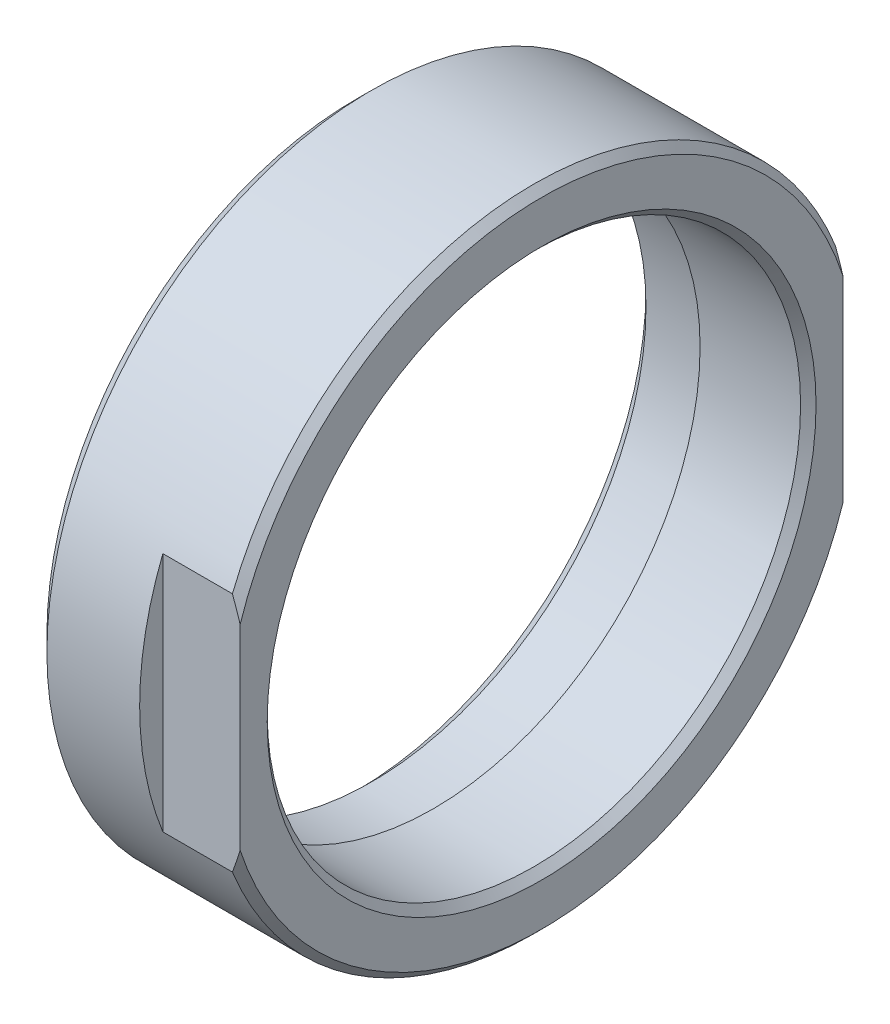
ISO-10303-21;
HEADER;
FILE_DESCRIPTION(('STEP AP214'),'2;1');
FILE_NAME('part.step','',(''),(''),'','','');
FILE_SCHEMA(('AUTOMOTIVE_DESIGN { 1 0 10303 214 1 1 1 1 }'));
ENDSEC;
DATA;
#1=APPLICATION_CONTEXT('core data for automotive mechanical design processes');
#2=APPLICATION_PROTOCOL_DEFINITION('international standard','automotive_design',2000,#1);
#3=PRODUCT_CONTEXT('',#1,'mechanical');
#4=PRODUCT('Part','Part','',(#3));
#5=PRODUCT_RELATED_PRODUCT_CATEGORY('part','',(#4));
#6=PRODUCT_DEFINITION_FORMATION('','',#4);
#7=PRODUCT_DEFINITION_CONTEXT('part definition',#1,'design');
#8=PRODUCT_DEFINITION('design','',#6,#7);
#9=PRODUCT_DEFINITION_SHAPE('','',#8);
#10=(LENGTH_UNIT() NAMED_UNIT(*) SI_UNIT(.MILLI.,.METRE.));
#11=(NAMED_UNIT(*) PLANE_ANGLE_UNIT() SI_UNIT($,.RADIAN.));
#12=(NAMED_UNIT(*) SI_UNIT($,.STERADIAN.) SOLID_ANGLE_UNIT());
#13=UNCERTAINTY_MEASURE_WITH_UNIT(LENGTH_MEASURE(1.E-05),#10,'distance_accuracy_value','');
#14=(GEOMETRIC_REPRESENTATION_CONTEXT(3) GLOBAL_UNCERTAINTY_ASSIGNED_CONTEXT((#13)) GLOBAL_UNIT_ASSIGNED_CONTEXT((#10,
#11,#12)) REPRESENTATION_CONTEXT('',''));
#15=CARTESIAN_POINT('',(0.,0.,0.));
#16=DIRECTION('',(0.,0.,1.));
#17=DIRECTION('',(1.,0.,0.));
#18=AXIS2_PLACEMENT_3D('',#15,#16,#17);
#19=CARTESIAN_POINT('',(7.,0.,0.));
#20=DIRECTION('',(-1.,0.,0.));
#21=DIRECTION('',(0.,0.,1.));
#22=AXIS2_PLACEMENT_3D('',#19,#20,#21);
#23=CONICAL_SURFACE('',#22,20.5,0.785398163397448);
#24=CARTESIAN_POINT('',(6.5,0.,0.));
#25=DIRECTION('',(-1.,0.,0.));
#26=DIRECTION('',(0.,0.,1.));
#27=AXIS2_PLACEMENT_3D('',#24,#25,#26);
#28=CIRCLE('',#27,21.);
#29=CARTESIAN_POINT('',(6.5,-7.79422863405995,-19.5));
#30=VERTEX_POINT('',#29);
#31=CARTESIAN_POINT('',(6.5,-7.79422863405995,19.5));
#32=VERTEX_POINT('',#31);
#33=EDGE_CURVE('E424',#30,#32,#28,.T.);
#34=ORIENTED_EDGE('',*,*,#33,.F.);
#35=CARTESIAN_POINT('',(4.02559022771401,-13.0689676010462,-19.5));
#36=CARTESIAN_POINT('',(4.21467649576726,-12.7292880290273,-19.5));
#37=CARTESIAN_POINT('',(4.39992767767238,-12.3874441642515,-19.5));
#38=CARTESIAN_POINT('',(4.76167257996181,-11.699043564784,-19.5));
#39=CARTESIAN_POINT('',(4.93816396556285,-11.352485604652,-19.5));
#40=CARTESIAN_POINT('',(5.28186083592724,-10.6531086769834,-19.5));
#41=CARTESIAN_POINT('',(5.44902795580901,-10.3002707420582,-19.5));
#42=CARTESIAN_POINT('',(5.77195802212845,-9.58947708795421,-19.5));
#43=CARTESIAN_POINT('',(5.92772178152389,-9.23152173578054,-19.5));
#44=CARTESIAN_POINT('',(6.37899208421128,-8.14170817660233,-19.5));
#45=CARTESIAN_POINT('',(6.65474010054072,-7.40136538964349,-19.5));
#46=CARTESIAN_POINT('',(7.0181906292127,-6.27538216389892,-19.5));
#47=CARTESIAN_POINT('',(7.13092307886018,-5.89772146450745,-19.5));
#48=CARTESIAN_POINT('',(7.33793155979777,-5.13739268548048,-19.5));
#49=CARTESIAN_POINT('',(7.43221016434908,-4.75472531194163,-19.5));
#50=CARTESIAN_POINT('',(7.6223065779861,-3.8853551597289,-19.5));
#51=CARTESIAN_POINT('',(7.71221727916309,-3.39734002874889,-19.5));
#52=CARTESIAN_POINT('',(7.85689445022468,-2.41600236527034,-19.5));
#53=CARTESIAN_POINT('',(7.91165539124363,-1.92267901021927,-19.5));
#54=CARTESIAN_POINT('',(7.98372044127381,-0.93592879001039,-19.5));
#55=CARTESIAN_POINT('',(8.00122306106405,-0.442516552707348,-19.5));
#56=CARTESIAN_POINT('',(7.99864473743575,0.54406375941298,-19.5));
#57=CARTESIAN_POINT('',(7.97857710084584,1.0372318588189,-19.5));
#58=CARTESIAN_POINT('',(7.91406366840323,1.86277821009126,-19.5));
#59=CARTESIAN_POINT('',(7.87950727189218,2.19596926857978,-19.5));
#60=CARTESIAN_POINT('',(7.79404236541663,2.86067964452545,-19.5));
#61=CARTESIAN_POINT('',(7.74311316365131,3.19219630450893,-19.5));
#62=CARTESIAN_POINT('',(7.62031641858737,3.88301530181948,-19.5));
#63=CARTESIAN_POINT('',(7.54694757437279,4.24205049601336,-19.5));
#64=CARTESIAN_POINT('',(7.38301811895306,4.95619114929825,-19.5));
#65=CARTESIAN_POINT('',(7.29245456660568,5.31129592508083,-19.5));
#66=CARTESIAN_POINT('',(6.99680923721623,6.37114337553112,-19.5));
#67=CARTESIAN_POINT('',(6.76796663578071,7.06937095816735,-19.5));
#68=CARTESIAN_POINT('',(6.38660677601917,8.10106752932882,-19.5));
#69=CARTESIAN_POINT('',(6.25333452561963,8.44192779902955,-19.5));
#70=CARTESIAN_POINT('',(5.97533751028387,9.11900884462383,-19.5));
#71=CARTESIAN_POINT('',(5.83061182252213,9.45522924410576,-19.5));
#72=CARTESIAN_POINT('',(5.53155411297544,10.1218124797302,-19.5));
#73=CARTESIAN_POINT('',(5.3772605525044,10.4521926786344,-19.5));
#74=CARTESIAN_POINT('',(5.05970789704385,11.1085072429217,-19.5));
#75=CARTESIAN_POINT('',(4.8964513230176,11.4344428265383,-19.5));
#76=CARTESIAN_POINT('',(4.72923526349907,11.7583045837856,-19.5));
#77=B_SPLINE_CURVE_WITH_KNOTS('',3,(#35,#36,#37,#38,#39,#40,#41,#42,#43,#44,#45,#46,#47,#48,#49,
#50,#51,#52,#53,#54,#55,#56,#57,#58,#59,#60,#61,#62,#63,#64,#65,#66,#67,#68,#69,#70,#71,#72,#73,
#74,#75,#76),.UNSPECIFIED.,.F.,.F.,(4,2,2,2,2,2,2,2,2,2,2,2,2,2,2,2,2,2,2,2,4),(0.,
1.1662962795337,2.33290176543608,3.50399847640231,4.67501161716596,7.04203211707805,
8.22403908529728,9.40588111320758,10.8933565636685,12.38106592861,13.8608287936657,
15.3400676477707,16.3446208644487,17.3504486502185,18.4493388547217,19.5484171932051,
21.7497598968479,22.8475929393737,23.9455145266558,25.0392776116764,26.1327346222282),.UNSPECIFIED.);
#78=CARTESIAN_POINT('',(7.,-6.32455532033676,-19.5));
#79=VERTEX_POINT('',#78);
#80=EDGE_CURVE('E410',#30,#79,#77,.T.);
#81=ORIENTED_EDGE('',*,*,#80,.T.);
#82=CARTESIAN_POINT('',(7.,0.,0.));
#83=DIRECTION('',(-1.,0.,0.));
#84=DIRECTION('',(0.,0.,1.));
#85=AXIS2_PLACEMENT_3D('',#82,#83,#84);
#86=CIRCLE('',#85,20.5);
#87=CARTESIAN_POINT('',(7.,-6.32455532033676,19.5));
#88=VERTEX_POINT('',#87);
#89=EDGE_CURVE('E423',#79,#88,#86,.T.);
#90=ORIENTED_EDGE('',*,*,#89,.T.);
#91=CARTESIAN_POINT('',(4.72923526349907,11.7583045837856,19.5));
#92=CARTESIAN_POINT('',(4.8964513230176,11.4344428265383,19.5));
#93=CARTESIAN_POINT('',(5.05970789704385,11.1085072429217,19.5));
#94=CARTESIAN_POINT('',(5.3772605525044,10.4521926786344,19.5));
#95=CARTESIAN_POINT('',(5.53155411297543,10.1218124797302,19.5));
#96=CARTESIAN_POINT('',(5.83061182252212,9.45522924410576,19.5));
#97=CARTESIAN_POINT('',(5.97533751028387,9.11900884462383,19.5));
#98=CARTESIAN_POINT('',(6.25333452561963,8.44192779902956,19.5));
#99=CARTESIAN_POINT('',(6.38660677601917,8.10106752932882,19.5));
#100=CARTESIAN_POINT('',(6.76796663578071,7.06937095816735,19.5));
#101=CARTESIAN_POINT('',(6.99680923721623,6.37114337553112,19.5));
#102=CARTESIAN_POINT('',(7.29245456660568,5.31129592508083,19.5));
#103=CARTESIAN_POINT('',(7.38301811895306,4.95619114929825,19.5));
#104=CARTESIAN_POINT('',(7.54694757437279,4.24205049601336,19.5));
#105=CARTESIAN_POINT('',(7.62031641858737,3.88301530181948,19.5));
#106=CARTESIAN_POINT('',(7.74311316365131,3.19219630450893,19.5));
#107=CARTESIAN_POINT('',(7.79404236541663,2.86067964452545,19.5));
#108=CARTESIAN_POINT('',(7.87950727189218,2.19596926857978,19.5));
#109=CARTESIAN_POINT('',(7.91406366840323,1.86277821009126,19.5));
#110=CARTESIAN_POINT('',(7.97857710084584,1.0372318588189,19.5));
#111=CARTESIAN_POINT('',(7.99864473743575,0.54406375941298,19.5));
#112=CARTESIAN_POINT('',(8.00122306106405,-0.442516552707347,19.5));
#113=CARTESIAN_POINT('',(7.98372044127381,-0.935928790010389,19.5));
#114=CARTESIAN_POINT('',(7.91165539124363,-1.92267901021927,19.5));
#115=CARTESIAN_POINT('',(7.85689445022468,-2.41600236527034,19.5));
#116=CARTESIAN_POINT('',(7.71221727916309,-3.39734002874889,19.5));
#117=CARTESIAN_POINT('',(7.6223065779861,-3.8853551597289,19.5));
#118=CARTESIAN_POINT('',(7.43221016434908,-4.75472531194163,19.5));
#119=CARTESIAN_POINT('',(7.33793155979777,-5.13739268548049,19.5));
#120=CARTESIAN_POINT('',(7.13092307886018,-5.89772146450746,19.5));
#121=CARTESIAN_POINT('',(7.0181906292127,-6.27538216389893,19.5));
#122=CARTESIAN_POINT('',(6.65474010054072,-7.40136538964349,19.5));
#123=CARTESIAN_POINT('',(6.37899208421127,-8.14170817660234,19.5));
#124=CARTESIAN_POINT('',(5.92772178152388,-9.23152173578055,19.5));
#125=CARTESIAN_POINT('',(5.77195802212845,-9.58947708795421,19.5));
#126=CARTESIAN_POINT('',(5.44902795580901,-10.3002707420582,19.5));
#127=CARTESIAN_POINT('',(5.28186083592724,-10.6531086769834,19.5));
#128=CARTESIAN_POINT('',(4.93816396556285,-11.352485604652,19.5));
#129=CARTESIAN_POINT('',(4.76167257996181,-11.699043564784,19.5));
#130=CARTESIAN_POINT('',(4.39992767767238,-12.3874441642515,19.5));
#131=CARTESIAN_POINT('',(4.21467649576727,-12.7292880290273,19.5));
#132=CARTESIAN_POINT('',(4.02559022771401,-13.0689676010462,19.5));
#133=B_SPLINE_CURVE_WITH_KNOTS('',3,(#91,#92,#93,#94,#95,#96,#97,#98,#99,#100,#101,#102,#103,
#104,#105,#106,#107,#108,#109,#110,#111,#112,#113,#114,#115,#116,#117,#118,#119,#120,#121,#122,
#123,#124,#125,#126,#127,#128,#129,#130,#131,#132),.UNSPECIFIED.,.F.,.F.,(4,2,2,2,2,2,2,2,2,2,2,
2,2,2,2,2,2,2,2,2,4),(0.,1.09345701055185,2.18722009557242,3.28514168285458,4.38297472538039,
6.58431742902316,7.68339576750655,8.78228597200972,9.78811375777953,10.7926669744575,
12.2719058285625,13.7516686936182,15.2393780585598,16.7268535090207,17.908695536931,
19.0907025051502,21.4577230050623,22.6287361458259,23.7998328567922,24.9664383426945,
26.1327346222282),.UNSPECIFIED.);
#134=EDGE_CURVE('E453',#88,#32,#133,.T.);
#135=ORIENTED_EDGE('',*,*,#134,.T.);
#136=EDGE_LOOP('',(#34,#81,#90,#135));
#137=FACE_BOUND('',#136,.T.);
#138=ADVANCED_FACE('F350',(#137),#23,.T.);
#139=CARTESIAN_POINT('',(0.,17.25,0.));
#140=DIRECTION('',(1.,0.,0.));
#141=DIRECTION('',(0.,0.,-1.));
#142=AXIS2_PLACEMENT_3D('',#139,#140,#141);
#143=PLANE('',#142);
#144=CARTESIAN_POINT('',(0.,0.,0.));
#145=DIRECTION('',(-1.,0.,0.));
#146=DIRECTION('',(0.,0.,1.));
#147=AXIS2_PLACEMENT_3D('',#144,#145,#146);
#148=CIRCLE('',#147,17.25);
#149=CARTESIAN_POINT('',(0.,0.,17.25));
#150=VERTEX_POINT('',#149);
#151=EDGE_CURVE('E439',#150,#150,#148,.T.);
#152=ORIENTED_EDGE('',*,*,#151,.F.);
#153=EDGE_LOOP('',(#152));
#154=FACE_BOUND('',#153,.T.);
#155=CARTESIAN_POINT('',(0.,0.,0.));
#156=DIRECTION('',(-1.,0.,0.));
#157=DIRECTION('',(0.,0.,1.));
#158=AXIS2_PLACEMENT_3D('',#155,#156,#157);
#159=CIRCLE('',#158,17.75);
#160=CARTESIAN_POINT('',(0.,0.,17.75));
#161=VERTEX_POINT('',#160);
#162=EDGE_CURVE('E456',#161,#161,#159,.T.);
#163=ORIENTED_EDGE('',*,*,#162,.T.);
#164=EDGE_LOOP('',(#163));
#165=FACE_BOUND('',#164,.T.);
#166=ADVANCED_FACE('F352',(#154,#165),#143,.F.);
#167=CARTESIAN_POINT('',(-33.0758241758242,0.,0.));
#168=DIRECTION('',(-1.,0.,0.));
#169=DIRECTION('',(0.,0.,1.));
#170=AXIS2_PLACEMENT_3D('',#167,#168,#169);
#171=CYLINDRICAL_SURFACE('',#170,17.25);
#172=CARTESIAN_POINT('',(6.5,0.,0.));
#173=DIRECTION('',(-1.,0.,0.));
#174=DIRECTION('',(0.,0.,1.));
#175=AXIS2_PLACEMENT_3D('',#172,#173,#174);
#176=CIRCLE('',#175,17.25);
#177=CARTESIAN_POINT('',(6.5,0.,17.25));
#178=VERTEX_POINT('',#177);
#179=EDGE_CURVE('E436',#178,#178,#176,.T.);
#180=ORIENTED_EDGE('',*,*,#179,.F.);
#181=EDGE_LOOP('',(#180));
#182=FACE_BOUND('',#181,.T.);
#183=ORIENTED_EDGE('',*,*,#151,.T.);
#184=EDGE_LOOP('',(#183));
#185=FACE_BOUND('',#184,.T.);
#186=ADVANCED_FACE('F506',(#182,#185),#171,.F.);
#187=CARTESIAN_POINT('',(6.5,0.,0.));
#188=DIRECTION('',(1.,0.,0.));
#189=DIRECTION('',(0.,0.,-1.));
#190=AXIS2_PLACEMENT_3D('',#187,#188,#189);
#191=CONICAL_SURFACE('',#190,17.25,0.785398163397448);
#192=CARTESIAN_POINT('',(7.,0.,0.));
#193=DIRECTION('',(-1.,0.,0.));
#194=DIRECTION('',(0.,0.,1.));
#195=AXIS2_PLACEMENT_3D('',#192,#193,#194);
#196=CIRCLE('',#195,17.75);
#197=CARTESIAN_POINT('',(7.,0.,17.75));
#198=VERTEX_POINT('',#197);
#199=EDGE_CURVE('E433',#198,#198,#196,.T.);
#200=ORIENTED_EDGE('',*,*,#199,.F.);
#201=EDGE_LOOP('',(#200));
#202=FACE_BOUND('',#201,.T.);
#203=ORIENTED_EDGE('',*,*,#179,.T.);
#204=EDGE_LOOP('',(#203));
#205=FACE_BOUND('',#204,.T.);
#206=ADVANCED_FACE('F511',(#202,#205),#191,.F.);
#207=CARTESIAN_POINT('',(7.,20.5,0.));
#208=DIRECTION('',(-1.,0.,0.));
#209=DIRECTION('',(0.,0.,1.));
#210=AXIS2_PLACEMENT_3D('',#207,#208,#209);
#211=PLANE('',#210);
#212=ORIENTED_EDGE('',*,*,#89,.F.);
#213=DIRECTION('',(0.,-1.,0.));
#214=VECTOR('',#213,1.);
#215=CARTESIAN_POINT('',(7.,14.7209653092006,-19.5));
#216=LINE('',#215,#214);
#217=CARTESIAN_POINT('',(7.,6.32455532033676,-19.5));
#218=VERTEX_POINT('',#217);
#219=EDGE_CURVE('E411',#218,#79,#216,.T.);
#220=ORIENTED_EDGE('',*,*,#219,.F.);
#221=CARTESIAN_POINT('',(7.,6.32455532033676,19.5));
#222=VERTEX_POINT('',#221);
#223=EDGE_CURVE('E426',#222,#218,#86,.T.);
#224=ORIENTED_EDGE('',*,*,#223,.F.);
#225=DIRECTION('',(0.,1.,0.));
#226=VECTOR('',#225,1.);
#227=CARTESIAN_POINT('',(7.,14.7209653092006,19.5));
#228=LINE('',#227,#226);
#229=EDGE_CURVE('E546',#88,#222,#228,.T.);
#230=ORIENTED_EDGE('',*,*,#229,.F.);
#231=EDGE_LOOP('',(#212,#220,#224,#230));
#232=FACE_BOUND('',#231,.T.);
#233=ORIENTED_EDGE('',*,*,#199,.T.);
#234=EDGE_LOOP('',(#233));
#235=FACE_BOUND('',#234,.T.);
#236=ADVANCED_FACE('F500',(#232,#235),#211,.F.);
#237=ORIENTED_EDGE('',*,*,#223,.T.);
#238=CARTESIAN_POINT('',(6.5,7.79422863405995,-19.5));
#239=VERTEX_POINT('',#238);
#240=EDGE_CURVE('E547',#218,#239,#77,.T.);
#241=ORIENTED_EDGE('',*,*,#240,.T.);
#242=CARTESIAN_POINT('',(6.5,7.79422863405995,19.5));
#243=VERTEX_POINT('',#242);
#244=EDGE_CURVE('E418',#243,#239,#28,.T.);
#245=ORIENTED_EDGE('',*,*,#244,.F.);
#246=EDGE_CURVE('E457',#243,#222,#133,.T.);
#247=ORIENTED_EDGE('',*,*,#246,.T.);
#248=EDGE_LOOP('',(#237,#241,#245,#247));
#249=FACE_BOUND('',#248,.T.);
#250=ADVANCED_FACE('F470',(#249),#23,.T.);
#251=CARTESIAN_POINT('',(-33.0758241758242,0.,0.));
#252=DIRECTION('',(-1.,0.,0.));
#253=DIRECTION('',(0.,0.,1.));
#254=AXIS2_PLACEMENT_3D('',#251,#252,#253);
#255=CYLINDRICAL_SURFACE('',#254,21.);
#256=ORIENTED_EDGE('',*,*,#244,.T.);
#257=DIRECTION('',(-1.,0.,0.));
#258=VECTOR('',#257,1.);
#259=CARTESIAN_POINT('',(-33.0758241758242,7.79422863405995,-19.5));
#260=LINE('',#259,#258);
#261=CARTESIAN_POINT('',(2.,7.79422863405996,-19.5));
#262=VERTEX_POINT('',#261);
#263=EDGE_CURVE('E11',#239,#262,#260,.T.);
#264=ORIENTED_EDGE('',*,*,#263,.T.);
#265=CARTESIAN_POINT('',(2.,0.,0.));
#266=DIRECTION('',(1.,0.,0.));
#267=DIRECTION('',(0.,0.,-1.));
#268=AXIS2_PLACEMENT_3D('',#265,#266,#267);
#269=CIRCLE('',#268,21.);
#270=CARTESIAN_POINT('',(2.,-7.79422863405996,-19.5));
#271=VERTEX_POINT('',#270);
#272=EDGE_CURVE('E401',#271,#262,#269,.T.);
#273=ORIENTED_EDGE('',*,*,#272,.F.);
#274=DIRECTION('',(-1.,0.,0.));
#275=VECTOR('',#274,1.);
#276=CARTESIAN_POINT('',(-33.0758241758242,-7.79422863405995,-19.5));
#277=LINE('',#276,#275);
#278=EDGE_CURVE('E358',#271,#30,#277,.F.);
#279=ORIENTED_EDGE('',*,*,#278,.T.);
#280=ORIENTED_EDGE('',*,*,#33,.T.);
#281=DIRECTION('',(-1.,0.,0.));
#282=VECTOR('',#281,1.);
#283=CARTESIAN_POINT('',(-33.0758241758242,-7.79422863405995,19.5));
#284=LINE('',#283,#282);
#285=CARTESIAN_POINT('',(2.,-7.79422863405996,19.5));
#286=VERTEX_POINT('',#285);
#287=EDGE_CURVE('E405',#32,#286,#284,.T.);
#288=ORIENTED_EDGE('',*,*,#287,.T.);
#289=CARTESIAN_POINT('',(2.,0.,0.));
#290=DIRECTION('',(1.,0.,0.));
#291=DIRECTION('',(0.,0.,-1.));
#292=AXIS2_PLACEMENT_3D('',#289,#290,#291);
#293=CIRCLE('',#292,21.);
#294=CARTESIAN_POINT('',(2.,7.79422863405996,19.5));
#295=VERTEX_POINT('',#294);
#296=EDGE_CURVE('E442',#295,#286,#293,.T.);
#297=ORIENTED_EDGE('',*,*,#296,.F.);
#298=DIRECTION('',(-1.,0.,0.));
#299=VECTOR('',#298,1.);
#300=CARTESIAN_POINT('',(-33.0758241758242,7.79422863405995,19.5));
#301=LINE('',#300,#299);
#302=EDGE_CURVE('E420',#295,#243,#301,.F.);
#303=ORIENTED_EDGE('',*,*,#302,.T.);
#304=EDGE_LOOP('',(#256,#264,#273,#279,#280,#288,#297,#303));
#305=FACE_BOUND('',#304,.T.);
#306=CARTESIAN_POINT('',(-4.,0.,0.));
#307=DIRECTION('',(-1.,0.,0.));
#308=DIRECTION('',(0.,0.,1.));
#309=AXIS2_PLACEMENT_3D('',#306,#307,#308);
#310=CIRCLE('',#309,21.);
#311=CARTESIAN_POINT('',(-4.,0.,21.));
#312=VERTEX_POINT('',#311);
#313=EDGE_CURVE('E428',#312,#312,#310,.T.);
#314=ORIENTED_EDGE('',*,*,#313,.F.);
#315=EDGE_LOOP('',(#314));
#316=FACE_BOUND('',#315,.T.);
#317=ADVANCED_FACE('F414',(#305,#316),#255,.T.);
#318=CARTESIAN_POINT('',(-4.,0.,0.));
#319=DIRECTION('',(1.,0.,0.));
#320=DIRECTION('',(0.,0.,-1.));
#321=AXIS2_PLACEMENT_3D('',#318,#319,#320);
#322=CONICAL_SURFACE('',#321,21.,0.785398163397448);
#323=CARTESIAN_POINT('',(-5.,0.,0.));
#324=DIRECTION('',(-1.,0.,0.));
#325=DIRECTION('',(0.,0.,1.));
#326=AXIS2_PLACEMENT_3D('',#323,#324,#325);
#327=CIRCLE('',#326,20.);
#328=CARTESIAN_POINT('',(-5.,0.,20.));
#329=VERTEX_POINT('',#328);
#330=EDGE_CURVE('E521',#329,#329,#327,.T.);
#331=ORIENTED_EDGE('',*,*,#330,.F.);
#332=EDGE_LOOP('',(#331));
#333=FACE_BOUND('',#332,.T.);
#334=ORIENTED_EDGE('',*,*,#313,.T.);
#335=EDGE_LOOP('',(#334));
#336=FACE_BOUND('',#335,.T.);
#337=ADVANCED_FACE('F492',(#333,#336),#322,.T.);
#338=CARTESIAN_POINT('',(-5.,18.75,0.));
#339=DIRECTION('',(1.,0.,0.));
#340=DIRECTION('',(0.,0.,-1.));
#341=AXIS2_PLACEMENT_3D('',#338,#339,#340);
#342=PLANE('',#341);
#343=CARTESIAN_POINT('',(-5.,0.,0.));
#344=DIRECTION('',(-1.,0.,0.));
#345=DIRECTION('',(0.,0.,1.));
#346=AXIS2_PLACEMENT_3D('',#343,#344,#345);
#347=CIRCLE('',#346,18.75);
#348=CARTESIAN_POINT('',(-5.,0.,18.75));
#349=VERTEX_POINT('',#348);
#350=EDGE_CURVE('E519',#349,#349,#347,.T.);
#351=ORIENTED_EDGE('',*,*,#350,.F.);
#352=EDGE_LOOP('',(#351));
#353=FACE_BOUND('',#352,.T.);
#354=ORIENTED_EDGE('',*,*,#330,.T.);
#355=EDGE_LOOP('',(#354));
#356=FACE_BOUND('',#355,.T.);
#357=ADVANCED_FACE('F488',(#353,#356),#342,.F.);
#358=CARTESIAN_POINT('',(-5.,0.,0.));
#359=DIRECTION('',(-1.,0.,0.));
#360=DIRECTION('',(0.,0.,1.));
#361=AXIS2_PLACEMENT_3D('',#358,#359,#360);
#362=CONICAL_SURFACE('',#361,18.75,0.785398163397448);
#363=CARTESIAN_POINT('',(-4.,0.,0.));
#364=DIRECTION('',(-1.,0.,0.));
#365=DIRECTION('',(0.,0.,1.));
#366=AXIS2_PLACEMENT_3D('',#363,#364,#365);
#367=CIRCLE('',#366,17.75);
#368=CARTESIAN_POINT('',(-4.,0.,17.75));
#369=VERTEX_POINT('',#368);
#370=EDGE_CURVE('E460',#369,#369,#367,.T.);
#371=ORIENTED_EDGE('',*,*,#370,.F.);
#372=EDGE_LOOP('',(#371));
#373=FACE_BOUND('',#372,.T.);
#374=ORIENTED_EDGE('',*,*,#350,.T.);
#375=EDGE_LOOP('',(#374));
#376=FACE_BOUND('',#375,.T.);
#377=ADVANCED_FACE('F484',(#373,#376),#362,.F.);
#378=CARTESIAN_POINT('',(-33.0758241758242,0.,0.));
#379=DIRECTION('',(-1.,0.,0.));
#380=DIRECTION('',(0.,0.,1.));
#381=AXIS2_PLACEMENT_3D('',#378,#379,#380);
#382=CYLINDRICAL_SURFACE('',#381,17.75);
#383=ORIENTED_EDGE('',*,*,#162,.F.);
#384=EDGE_LOOP('',(#383));
#385=FACE_BOUND('',#384,.T.);
#386=ORIENTED_EDGE('',*,*,#370,.T.);
#387=EDGE_LOOP('',(#386));
#388=FACE_BOUND('',#387,.T.);
#389=ADVANCED_FACE('F480',(#385,#388),#382,.F.);
#390=CARTESIAN_POINT('',(2.,14.7209653092006,19.5));
#391=DIRECTION('',(0.,0.,-1.));
#392=DIRECTION('',(0.,1.,0.));
#393=AXIS2_PLACEMENT_3D('',#390,#391,#392);
#394=PLANE('',#393);
#395=ORIENTED_EDGE('',*,*,#229,.T.);
#396=ORIENTED_EDGE('',*,*,#246,.F.);
#397=ORIENTED_EDGE('',*,*,#302,.F.);
#398=DIRECTION('',(0.,1.,0.));
#399=VECTOR('',#398,1.);
#400=CARTESIAN_POINT('',(2.,14.7209653092006,19.5));
#401=LINE('',#400,#399);
#402=EDGE_CURVE('E371',#286,#295,#401,.T.);
#403=ORIENTED_EDGE('',*,*,#402,.F.);
#404=ORIENTED_EDGE('',*,*,#287,.F.);
#405=ORIENTED_EDGE('',*,*,#134,.F.);
#406=EDGE_LOOP('',(#395,#396,#397,#403,#404,#405));
#407=FACE_BOUND('',#406,.T.);
#408=ADVANCED_FACE('F474',(#407),#394,.F.);
#409=CARTESIAN_POINT('',(2.,-15.5656108597285,25.895173453997));
#410=DIRECTION('',(1.,0.,0.));
#411=DIRECTION('',(0.,0.,-1.));
#412=AXIS2_PLACEMENT_3D('',#409,#410,#411);
#413=PLANE('',#412);
#414=ORIENTED_EDGE('',*,*,#296,.T.);
#415=ORIENTED_EDGE('',*,*,#402,.T.);
#416=EDGE_LOOP('',(#414,#415));
#417=FACE_BOUND('',#416,.T.);
#418=ADVANCED_FACE('F479',(#417),#413,.T.);
#419=CARTESIAN_POINT('',(2.,14.7209653092006,-19.5));
#420=DIRECTION('',(0.,0.,1.));
#421=DIRECTION('',(0.,-1.,0.));
#422=AXIS2_PLACEMENT_3D('',#419,#420,#421);
#423=PLANE('',#422);
#424=ORIENTED_EDGE('',*,*,#219,.T.);
#425=ORIENTED_EDGE('',*,*,#80,.F.);
#426=ORIENTED_EDGE('',*,*,#278,.F.);
#427=DIRECTION('',(0.,-1.,0.));
#428=VECTOR('',#427,1.);
#429=CARTESIAN_POINT('',(2.,14.7209653092006,-19.5));
#430=LINE('',#429,#428);
#431=EDGE_CURVE('E364',#262,#271,#430,.T.);
#432=ORIENTED_EDGE('',*,*,#431,.F.);
#433=ORIENTED_EDGE('',*,*,#263,.F.);
#434=ORIENTED_EDGE('',*,*,#240,.F.);
#435=EDGE_LOOP('',(#424,#425,#426,#432,#433,#434));
#436=FACE_BOUND('',#435,.T.);
#437=ADVANCED_FACE('F408',(#436),#423,.F.);
#438=CARTESIAN_POINT('',(2.,14.7209653092006,-19.5));
#439=DIRECTION('',(1.,0.,0.));
#440=DIRECTION('',(0.,0.,-1.));
#441=AXIS2_PLACEMENT_3D('',#438,#439,#440);
#442=PLANE('',#441);
#443=ORIENTED_EDGE('',*,*,#272,.T.);
#444=ORIENTED_EDGE('',*,*,#431,.T.);
#445=EDGE_LOOP('',(#443,#444));
#446=FACE_BOUND('',#445,.T.);
#447=ADVANCED_FACE('F402',(#446),#442,.T.);
#448=CLOSED_SHELL('',(#138,#166,#186,#206,#236,#250,#317,#337,#357,#377,#389,#408,#418,#437,#447));
#449=MANIFOLD_SOLID_BREP('B2',#448);
#450=ADVANCED_BREP_SHAPE_REPRESENTATION('',(#18,#449),#14);
#451=SHAPE_DEFINITION_REPRESENTATION(#9,#450);
ENDSEC;
END-ISO-10303-21;
